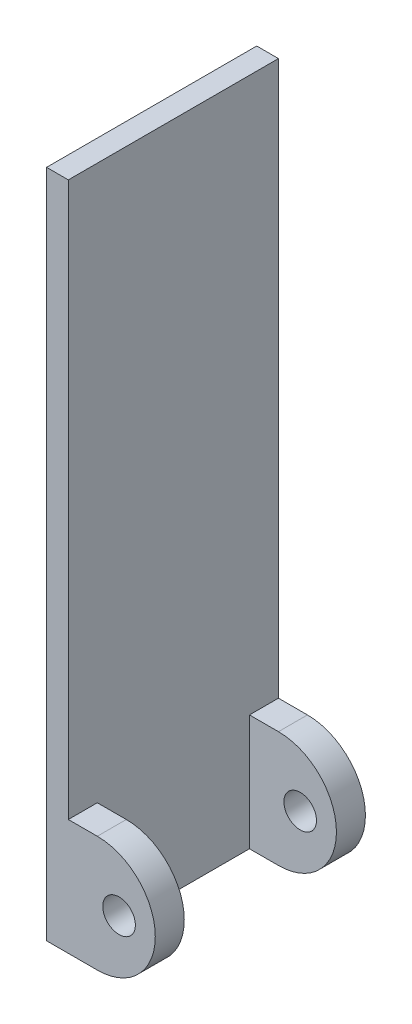
ISO-10303-21;
HEADER;
FILE_DESCRIPTION(('STEP AP214'),'2;1');
FILE_NAME('part.step','',(''),(''),'','','');
FILE_SCHEMA(('AUTOMOTIVE_DESIGN { 1 0 10303 214 1 1 1 1 }'));
ENDSEC;
DATA;
#1=APPLICATION_CONTEXT('core data for automotive mechanical design processes');
#2=APPLICATION_PROTOCOL_DEFINITION('international standard','automotive_design',2000,#1);
#3=PRODUCT_CONTEXT('',#1,'mechanical');
#4=PRODUCT('Part','Part','',(#3));
#5=PRODUCT_RELATED_PRODUCT_CATEGORY('part','',(#4));
#6=PRODUCT_DEFINITION_FORMATION('','',#4);
#7=PRODUCT_DEFINITION_CONTEXT('part definition',#1,'design');
#8=PRODUCT_DEFINITION('design','',#6,#7);
#9=PRODUCT_DEFINITION_SHAPE('','',#8);
#10=(LENGTH_UNIT() NAMED_UNIT(*) SI_UNIT(.MILLI.,.METRE.));
#11=(NAMED_UNIT(*) PLANE_ANGLE_UNIT() SI_UNIT($,.RADIAN.));
#12=(NAMED_UNIT(*) SI_UNIT($,.STERADIAN.) SOLID_ANGLE_UNIT());
#13=UNCERTAINTY_MEASURE_WITH_UNIT(LENGTH_MEASURE(1.E-05),#10,'distance_accuracy_value','');
#14=(GEOMETRIC_REPRESENTATION_CONTEXT(3) GLOBAL_UNCERTAINTY_ASSIGNED_CONTEXT((#13)) GLOBAL_UNIT_ASSIGNED_CONTEXT((#10,
#11,#12)) REPRESENTATION_CONTEXT('',''));
#15=CARTESIAN_POINT('',(0.,0.,0.));
#16=DIRECTION('',(0.,0.,1.));
#17=DIRECTION('',(1.,0.,0.));
#18=AXIS2_PLACEMENT_3D('',#15,#16,#17);
#19=CARTESIAN_POINT('',(5.5,-38.223,4.));
#20=DIRECTION('',(0.,0.,-1.));
#21=DIRECTION('',(-1.,0.,0.));
#22=AXIS2_PLACEMENT_3D('',#19,#20,#21);
#23=CYLINDRICAL_SURFACE('',#22,8.);
#24=DIRECTION('',(0.,0.,1.));
#25=VECTOR('',#24,1.);
#26=CARTESIAN_POINT('',(5.5,-30.223,4.));
#27=LINE('',#26,#25);
#28=CARTESIAN_POINT('',(5.5,-30.223,4.));
#29=VERTEX_POINT('',#28);
#30=CARTESIAN_POINT('',(5.5,-30.223,0.));
#31=VERTEX_POINT('',#30);
#32=EDGE_CURVE('E135',#29,#31,#27,.F.);
#33=ORIENTED_EDGE('',*,*,#32,.F.);
#34=CARTESIAN_POINT('',(5.5,-38.223,4.));
#35=DIRECTION('',(0.,0.,-1.));
#36=DIRECTION('',(-1.,0.,0.));
#37=AXIS2_PLACEMENT_3D('',#34,#35,#36);
#38=CIRCLE('',#37,8.);
#39=CARTESIAN_POINT('',(5.50000000000001,-46.223,4.));
#40=VERTEX_POINT('',#39);
#41=EDGE_CURVE('E45',#40,#29,#38,.F.);
#42=ORIENTED_EDGE('',*,*,#41,.F.);
#43=DIRECTION('',(0.,0.,-1.));
#44=VECTOR('',#43,1.);
#45=CARTESIAN_POINT('',(5.5,-46.223,29.));
#46=LINE('',#45,#44);
#47=CARTESIAN_POINT('',(5.5,-46.223,0.));
#48=VERTEX_POINT('',#47);
#49=EDGE_CURVE('E203',#48,#40,#46,.F.);
#50=ORIENTED_EDGE('',*,*,#49,.F.);
#51=CARTESIAN_POINT('',(5.5,-38.223,0.));
#52=DIRECTION('',(0.,0.,-1.));
#53=DIRECTION('',(-1.,0.,0.));
#54=AXIS2_PLACEMENT_3D('',#51,#52,#53);
#55=CIRCLE('',#54,8.);
#56=EDGE_CURVE('E11',#31,#48,#55,.T.);
#57=ORIENTED_EDGE('',*,*,#56,.F.);
#58=EDGE_LOOP('',(#33,#42,#50,#57));
#59=FACE_BOUND('',#58,.T.);
#60=ADVANCED_FACE('F37',(#59),#23,.T.);
#61=CARTESIAN_POINT('',(5.5,-38.223,29.));
#62=DIRECTION('',(0.,0.,1.));
#63=DIRECTION('',(1.,0.,0.));
#64=AXIS2_PLACEMENT_3D('',#61,#62,#63);
#65=CYLINDRICAL_SURFACE('',#64,8.);
#66=DIRECTION('',(0.,0.,-1.));
#67=VECTOR('',#66,1.);
#68=CARTESIAN_POINT('',(5.5,-30.223,29.));
#69=LINE('',#68,#67);
#70=CARTESIAN_POINT('',(5.5,-30.223,29.));
#71=VERTEX_POINT('',#70);
#72=CARTESIAN_POINT('',(5.5,-30.223,25.));
#73=VERTEX_POINT('',#72);
#74=EDGE_CURVE('E192',#71,#73,#69,.T.);
#75=ORIENTED_EDGE('',*,*,#74,.F.);
#76=CARTESIAN_POINT('',(5.5,-38.223,29.));
#77=DIRECTION('',(0.,0.,-1.));
#78=DIRECTION('',(-1.,0.,0.));
#79=AXIS2_PLACEMENT_3D('',#76,#77,#78);
#80=CIRCLE('',#79,8.);
#81=CARTESIAN_POINT('',(5.5,-46.223,29.));
#82=VERTEX_POINT('',#81);
#83=EDGE_CURVE('E198',#82,#71,#80,.F.);
#84=ORIENTED_EDGE('',*,*,#83,.F.);
#85=DIRECTION('',(0.,0.,-1.));
#86=VECTOR('',#85,1.);
#87=CARTESIAN_POINT('',(5.5,-46.223,29.));
#88=LINE('',#87,#86);
#89=CARTESIAN_POINT('',(5.50000000000001,-46.223,25.));
#90=VERTEX_POINT('',#89);
#91=EDGE_CURVE('E195',#90,#82,#88,.F.);
#92=ORIENTED_EDGE('',*,*,#91,.F.);
#93=CARTESIAN_POINT('',(5.5,-38.223,25.));
#94=DIRECTION('',(0.,0.,1.));
#95=DIRECTION('',(1.,0.,0.));
#96=AXIS2_PLACEMENT_3D('',#93,#94,#95);
#97=CIRCLE('',#96,8.);
#98=EDGE_CURVE('E200',#73,#90,#97,.F.);
#99=ORIENTED_EDGE('',*,*,#98,.F.);
#100=EDGE_LOOP('',(#75,#84,#92,#99));
#101=FACE_BOUND('',#100,.T.);
#102=ADVANCED_FACE('F234',(#101),#65,.T.);
#103=CARTESIAN_POINT('',(1.49999999999999,46.223,29.));
#104=DIRECTION('',(-1.,0.,0.));
#105=DIRECTION('',(0.,-1.,0.));
#106=AXIS2_PLACEMENT_3D('',#103,#104,#105);
#107=PLANE('',#106);
#108=DIRECTION('',(0.,1.,0.));
#109=VECTOR('',#108,1.);
#110=CARTESIAN_POINT('',(1.5,0.,4.));
#111=LINE('',#110,#109);
#112=CARTESIAN_POINT('',(1.50000000000001,-46.223,4.00000000000001));
#113=VERTEX_POINT('',#112);
#114=CARTESIAN_POINT('',(1.5,-30.223,4.));
#115=VERTEX_POINT('',#114);
#116=EDGE_CURVE('E126',#113,#115,#111,.T.);
#117=ORIENTED_EDGE('',*,*,#116,.T.);
#118=DIRECTION('',(0.,0.,-1.));
#119=VECTOR('',#118,1.);
#120=CARTESIAN_POINT('',(1.5,-30.223,4.));
#121=LINE('',#120,#119);
#122=CARTESIAN_POINT('',(1.5,-30.223,0.));
#123=VERTEX_POINT('',#122);
#124=EDGE_CURVE('E123',#115,#123,#121,.T.);
#125=ORIENTED_EDGE('',*,*,#124,.T.);
#126=DIRECTION('',(0.,1.,0.));
#127=VECTOR('',#126,1.);
#128=CARTESIAN_POINT('',(1.49999999999999,46.223,0.));
#129=LINE('',#128,#127);
#130=CARTESIAN_POINT('',(1.49999999999999,46.223,0.));
#131=VERTEX_POINT('',#130);
#132=EDGE_CURVE('E109',#123,#131,#129,.T.);
#133=ORIENTED_EDGE('',*,*,#132,.T.);
#134=DIRECTION('',(0.,0.,-1.));
#135=VECTOR('',#134,1.);
#136=CARTESIAN_POINT('',(1.49999999999999,46.223,29.));
#137=LINE('',#136,#135);
#138=CARTESIAN_POINT('',(1.49999999999999,46.223,29.));
#139=VERTEX_POINT('',#138);
#140=EDGE_CURVE('E185',#139,#131,#137,.T.);
#141=ORIENTED_EDGE('',*,*,#140,.F.);
#142=DIRECTION('',(0.,1.,0.));
#143=VECTOR('',#142,1.);
#144=CARTESIAN_POINT('',(1.49999999999999,46.223,29.));
#145=LINE('',#144,#143);
#146=CARTESIAN_POINT('',(1.5,-30.223,29.));
#147=VERTEX_POINT('',#146);
#148=EDGE_CURVE('E173',#147,#139,#145,.T.);
#149=ORIENTED_EDGE('',*,*,#148,.F.);
#150=DIRECTION('',(0.,0.,1.));
#151=VECTOR('',#150,1.);
#152=CARTESIAN_POINT('',(1.5,-30.223,25.));
#153=LINE('',#152,#151);
#154=CARTESIAN_POINT('',(1.5,-30.223,25.));
#155=VERTEX_POINT('',#154);
#156=EDGE_CURVE('E159',#155,#147,#153,.T.);
#157=ORIENTED_EDGE('',*,*,#156,.F.);
#158=DIRECTION('',(0.,1.,0.));
#159=VECTOR('',#158,1.);
#160=CARTESIAN_POINT('',(1.5,0.,25.));
#161=LINE('',#160,#159);
#162=CARTESIAN_POINT('',(1.50000000000001,-46.223,25.));
#163=VERTEX_POINT('',#162);
#164=EDGE_CURVE('E156',#163,#155,#161,.T.);
#165=ORIENTED_EDGE('',*,*,#164,.F.);
#166=DIRECTION('',(0.,0.,-1.));
#167=VECTOR('',#166,1.);
#168=CARTESIAN_POINT('',(1.50000000000001,-46.223,29.));
#169=LINE('',#168,#167);
#170=EDGE_CURVE('E187',#163,#113,#169,.T.);
#171=ORIENTED_EDGE('',*,*,#170,.T.);
#172=EDGE_LOOP('',(#117,#125,#133,#141,#149,#157,#165,#171));
#173=FACE_BOUND('',#172,.T.);
#174=ADVANCED_FACE('F124',(#173),#107,.F.);
#175=CARTESIAN_POINT('',(-1.50000000000001,46.223,29.));
#176=DIRECTION('',(1.,0.,0.));
#177=DIRECTION('',(0.,1.,0.));
#178=AXIS2_PLACEMENT_3D('',#175,#176,#177);
#179=PLANE('',#178);
#180=DIRECTION('',(0.,-1.,0.));
#181=VECTOR('',#180,1.);
#182=CARTESIAN_POINT('',(-1.50000000000001,46.223,0.));
#183=LINE('',#182,#181);
#184=CARTESIAN_POINT('',(-1.50000000000001,46.223,0.));
#185=VERTEX_POINT('',#184);
#186=CARTESIAN_POINT('',(-1.49999999999999,-46.223,0.));
#187=VERTEX_POINT('',#186);
#188=EDGE_CURVE('E166',#185,#187,#183,.T.);
#189=ORIENTED_EDGE('',*,*,#188,.T.);
#190=DIRECTION('',(0.,0.,-1.));
#191=VECTOR('',#190,1.);
#192=CARTESIAN_POINT('',(-1.49999999999999,-46.223,29.));
#193=LINE('',#192,#191);
#194=CARTESIAN_POINT('',(-1.49999999999999,-46.223,29.));
#195=VERTEX_POINT('',#194);
#196=EDGE_CURVE('E189',#195,#187,#193,.T.);
#197=ORIENTED_EDGE('',*,*,#196,.F.);
#198=DIRECTION('',(0.,-1.,0.));
#199=VECTOR('',#198,1.);
#200=CARTESIAN_POINT('',(-1.50000000000001,46.223,29.));
#201=LINE('',#200,#199);
#202=CARTESIAN_POINT('',(-1.50000000000001,46.223,29.));
#203=VERTEX_POINT('',#202);
#204=EDGE_CURVE('E167',#203,#195,#201,.T.);
#205=ORIENTED_EDGE('',*,*,#204,.F.);
#206=DIRECTION('',(0.,0.,-1.));
#207=VECTOR('',#206,1.);
#208=CARTESIAN_POINT('',(-1.50000000000001,46.223,29.));
#209=LINE('',#208,#207);
#210=EDGE_CURVE('E177',#203,#185,#209,.T.);
#211=ORIENTED_EDGE('',*,*,#210,.T.);
#212=EDGE_LOOP('',(#189,#197,#205,#211));
#213=FACE_BOUND('',#212,.T.);
#214=ADVANCED_FACE('F214',(#213),#179,.F.);
#215=CARTESIAN_POINT('',(1.50000000000001,-46.223,29.));
#216=DIRECTION('',(0.,1.,0.));
#217=DIRECTION('',(0.,0.,1.));
#218=AXIS2_PLACEMENT_3D('',#215,#216,#217);
#219=PLANE('',#218);
#220=DIRECTION('',(1.,0.,0.));
#221=VECTOR('',#220,1.);
#222=CARTESIAN_POINT('',(1.50000000000001,-46.223,0.));
#223=LINE('',#222,#221);
#224=EDGE_CURVE('E120',#187,#48,#223,.T.);
#225=ORIENTED_EDGE('',*,*,#224,.T.);
#226=ORIENTED_EDGE('',*,*,#49,.T.);
#227=DIRECTION('',(1.,0.,0.));
#228=VECTOR('',#227,1.);
#229=CARTESIAN_POINT('',(0.,-46.223,4.));
#230=LINE('',#229,#228);
#231=EDGE_CURVE('E140',#113,#40,#230,.T.);
#232=ORIENTED_EDGE('',*,*,#231,.F.);
#233=ORIENTED_EDGE('',*,*,#170,.F.);
#234=DIRECTION('',(1.,0.,0.));
#235=VECTOR('',#234,1.);
#236=CARTESIAN_POINT('',(0.,-46.223,25.));
#237=LINE('',#236,#235);
#238=EDGE_CURVE('E149',#163,#90,#237,.T.);
#239=ORIENTED_EDGE('',*,*,#238,.T.);
#240=ORIENTED_EDGE('',*,*,#91,.T.);
#241=DIRECTION('',(1.,0.,0.));
#242=VECTOR('',#241,1.);
#243=CARTESIAN_POINT('',(1.50000000000001,-46.223,29.));
#244=LINE('',#243,#242);
#245=EDGE_CURVE('E170',#195,#82,#244,.T.);
#246=ORIENTED_EDGE('',*,*,#245,.F.);
#247=ORIENTED_EDGE('',*,*,#196,.T.);
#248=EDGE_LOOP('',(#225,#226,#232,#233,#239,#240,#246,#247));
#249=FACE_BOUND('',#248,.T.);
#250=ADVANCED_FACE('F211',(#249),#219,.F.);
#251=CARTESIAN_POINT('',(1.49999999999999,46.223,29.));
#252=DIRECTION('',(0.,-1.,0.));
#253=DIRECTION('',(0.,0.,-1.));
#254=AXIS2_PLACEMENT_3D('',#251,#252,#253);
#255=PLANE('',#254);
#256=DIRECTION('',(-1.,0.,0.));
#257=VECTOR('',#256,1.);
#258=CARTESIAN_POINT('',(1.49999999999999,46.223,0.));
#259=LINE('',#258,#257);
#260=EDGE_CURVE('E116',#131,#185,#259,.T.);
#261=ORIENTED_EDGE('',*,*,#260,.T.);
#262=ORIENTED_EDGE('',*,*,#210,.F.);
#263=DIRECTION('',(-1.,0.,0.));
#264=VECTOR('',#263,1.);
#265=CARTESIAN_POINT('',(1.49999999999999,46.223,29.));
#266=LINE('',#265,#264);
#267=EDGE_CURVE('E175',#139,#203,#266,.T.);
#268=ORIENTED_EDGE('',*,*,#267,.F.);
#269=ORIENTED_EDGE('',*,*,#140,.T.);
#270=EDGE_LOOP('',(#261,#262,#268,#269));
#271=FACE_BOUND('',#270,.T.);
#272=ADVANCED_FACE('F219',(#271),#255,.F.);
#273=CARTESIAN_POINT('',(0.,0.,29.));
#274=DIRECTION('',(0.,0.,-1.));
#275=DIRECTION('',(-1.,0.,0.));
#276=AXIS2_PLACEMENT_3D('',#273,#274,#275);
#277=PLANE('',#276);
#278=ORIENTED_EDGE('',*,*,#245,.T.);
#279=ORIENTED_EDGE('',*,*,#83,.T.);
#280=DIRECTION('',(1.,0.,0.));
#281=VECTOR('',#280,1.);
#282=CARTESIAN_POINT('',(0.,-30.223,29.));
#283=LINE('',#282,#281);
#284=EDGE_CURVE('E150',#147,#71,#283,.T.);
#285=ORIENTED_EDGE('',*,*,#284,.F.);
#286=ORIENTED_EDGE('',*,*,#148,.T.);
#287=ORIENTED_EDGE('',*,*,#267,.T.);
#288=ORIENTED_EDGE('',*,*,#204,.T.);
#289=EDGE_LOOP('',(#278,#279,#285,#286,#287,#288));
#290=FACE_BOUND('',#289,.T.);
#291=CARTESIAN_POINT('',(8.49999999999999,-38.223,29.));
#292=DIRECTION('',(0.,0.,1.));
#293=DIRECTION('',(1.,0.,0.));
#294=AXIS2_PLACEMENT_3D('',#291,#292,#293);
#295=CIRCLE('',#294,2.25000000000001);
#296=CARTESIAN_POINT('',(10.75,-38.223,29.));
#297=VERTEX_POINT('',#296);
#298=EDGE_CURVE('E130',#297,#297,#295,.T.);
#299=ORIENTED_EDGE('',*,*,#298,.F.);
#300=EDGE_LOOP('',(#299));
#301=FACE_BOUND('',#300,.T.);
#302=ADVANCED_FACE('F223',(#290,#301),#277,.F.);
#303=CARTESIAN_POINT('',(0.,0.,0.));
#304=DIRECTION('',(0.,0.,-1.));
#305=DIRECTION('',(-1.,0.,0.));
#306=AXIS2_PLACEMENT_3D('',#303,#304,#305);
#307=PLANE('',#306);
#308=DIRECTION('',(1.,0.,0.));
#309=VECTOR('',#308,1.);
#310=CARTESIAN_POINT('',(0.,-30.223,0.));
#311=LINE('',#310,#309);
#312=EDGE_CURVE('E114',#123,#31,#311,.T.);
#313=ORIENTED_EDGE('',*,*,#312,.T.);
#314=ORIENTED_EDGE('',*,*,#56,.T.);
#315=ORIENTED_EDGE('',*,*,#224,.F.);
#316=ORIENTED_EDGE('',*,*,#188,.F.);
#317=ORIENTED_EDGE('',*,*,#260,.F.);
#318=ORIENTED_EDGE('',*,*,#132,.F.);
#319=EDGE_LOOP('',(#313,#314,#315,#316,#317,#318));
#320=FACE_BOUND('',#319,.T.);
#321=CARTESIAN_POINT('',(8.49999999999999,-38.223,0.));
#322=DIRECTION('',(0.,0.,1.));
#323=DIRECTION('',(1.,0.,0.));
#324=AXIS2_PLACEMENT_3D('',#321,#322,#323);
#325=CIRCLE('',#324,2.25000000000001);
#326=CARTESIAN_POINT('',(10.75,-38.223,0.));
#327=VERTEX_POINT('',#326);
#328=EDGE_CURVE('E137',#327,#327,#325,.T.);
#329=ORIENTED_EDGE('',*,*,#328,.T.);
#330=EDGE_LOOP('',(#329));
#331=FACE_BOUND('',#330,.T.);
#332=ADVANCED_FACE('F111',(#320,#331),#307,.T.);
#333=CARTESIAN_POINT('',(0.,-30.223,25.));
#334=DIRECTION('',(0.,-1.,0.));
#335=DIRECTION('',(0.,0.,-1.));
#336=AXIS2_PLACEMENT_3D('',#333,#334,#335);
#337=PLANE('',#336);
#338=ORIENTED_EDGE('',*,*,#284,.T.);
#339=ORIENTED_EDGE('',*,*,#74,.T.);
#340=DIRECTION('',(1.,0.,0.));
#341=VECTOR('',#340,1.);
#342=CARTESIAN_POINT('',(0.,-30.223,25.));
#343=LINE('',#342,#341);
#344=EDGE_CURVE('E153',#155,#73,#343,.T.);
#345=ORIENTED_EDGE('',*,*,#344,.F.);
#346=ORIENTED_EDGE('',*,*,#156,.T.);
#347=EDGE_LOOP('',(#338,#339,#345,#346));
#348=FACE_BOUND('',#347,.T.);
#349=ADVANCED_FACE('F227',(#348),#337,.F.);
#350=CARTESIAN_POINT('',(8.49999999999999,-38.223,25.));
#351=DIRECTION('',(0.,0.,1.));
#352=DIRECTION('',(1.,0.,0.));
#353=AXIS2_PLACEMENT_3D('',#350,#351,#352);
#354=CYLINDRICAL_SURFACE('',#353,2.25000000000001);
#355=CARTESIAN_POINT('',(8.49999999999999,-38.223,25.));
#356=DIRECTION('',(0.,0.,1.));
#357=DIRECTION('',(1.,0.,0.));
#358=AXIS2_PLACEMENT_3D('',#355,#356,#357);
#359=CIRCLE('',#358,2.25000000000001);
#360=CARTESIAN_POINT('',(10.75,-38.223,25.));
#361=VERTEX_POINT('',#360);
#362=EDGE_CURVE('E146',#361,#361,#359,.T.);
#363=ORIENTED_EDGE('',*,*,#362,.F.);
#364=EDGE_LOOP('',(#363));
#365=FACE_BOUND('',#364,.T.);
#366=ORIENTED_EDGE('',*,*,#298,.T.);
#367=EDGE_LOOP('',(#366));
#368=FACE_BOUND('',#367,.T.);
#369=ADVANCED_FACE('F255',(#365,#368),#354,.F.);
#370=CARTESIAN_POINT('',(0.,0.,25.));
#371=DIRECTION('',(0.,0.,1.));
#372=DIRECTION('',(1.,0.,0.));
#373=AXIS2_PLACEMENT_3D('',#370,#371,#372);
#374=PLANE('',#373);
#375=ORIENTED_EDGE('',*,*,#362,.T.);
#376=EDGE_LOOP('',(#375));
#377=FACE_BOUND('',#376,.T.);
#378=ORIENTED_EDGE('',*,*,#344,.T.);
#379=ORIENTED_EDGE('',*,*,#98,.T.);
#380=ORIENTED_EDGE('',*,*,#238,.F.);
#381=ORIENTED_EDGE('',*,*,#164,.T.);
#382=EDGE_LOOP('',(#378,#379,#380,#381));
#383=FACE_BOUND('',#382,.T.);
#384=ADVANCED_FACE('F230',(#377,#383),#374,.F.);
#385=CARTESIAN_POINT('',(0.,-30.223,4.));
#386=DIRECTION('',(0.,1.,0.));
#387=DIRECTION('',(0.,0.,1.));
#388=AXIS2_PLACEMENT_3D('',#385,#386,#387);
#389=PLANE('',#388);
#390=DIRECTION('',(1.,0.,0.));
#391=VECTOR('',#390,1.);
#392=CARTESIAN_POINT('',(0.,-30.223,4.));
#393=LINE('',#392,#391);
#394=EDGE_CURVE('E131',#115,#29,#393,.T.);
#395=ORIENTED_EDGE('',*,*,#394,.T.);
#396=ORIENTED_EDGE('',*,*,#32,.T.);
#397=ORIENTED_EDGE('',*,*,#312,.F.);
#398=ORIENTED_EDGE('',*,*,#124,.F.);
#399=EDGE_LOOP('',(#395,#396,#397,#398));
#400=FACE_BOUND('',#399,.T.);
#401=ADVANCED_FACE('F134',(#400),#389,.T.);
#402=CARTESIAN_POINT('',(8.49999999999999,-38.223,4.));
#403=DIRECTION('',(0.,0.,-1.));
#404=DIRECTION('',(-1.,0.,0.));
#405=AXIS2_PLACEMENT_3D('',#402,#403,#404);
#406=CYLINDRICAL_SURFACE('',#405,2.25000000000001);
#407=CARTESIAN_POINT('',(8.49999999999999,-38.223,4.));
#408=DIRECTION('',(0.,0.,1.));
#409=DIRECTION('',(1.,0.,0.));
#410=AXIS2_PLACEMENT_3D('',#407,#408,#409);
#411=CIRCLE('',#410,2.25000000000001);
#412=CARTESIAN_POINT('',(10.75,-38.223,4.));
#413=VERTEX_POINT('',#412);
#414=EDGE_CURVE('E136',#413,#413,#411,.T.);
#415=ORIENTED_EDGE('',*,*,#414,.T.);
#416=EDGE_LOOP('',(#415));
#417=FACE_BOUND('',#416,.T.);
#418=ORIENTED_EDGE('',*,*,#328,.F.);
#419=EDGE_LOOP('',(#418));
#420=FACE_BOUND('',#419,.T.);
#421=ADVANCED_FACE('F264',(#417,#420),#406,.F.);
#422=CARTESIAN_POINT('',(0.,0.,4.));
#423=DIRECTION('',(0.,0.,-1.));
#424=DIRECTION('',(1.,0.,0.));
#425=AXIS2_PLACEMENT_3D('',#422,#423,#424);
#426=PLANE('',#425);
#427=ORIENTED_EDGE('',*,*,#414,.F.);
#428=EDGE_LOOP('',(#427));
#429=FACE_BOUND('',#428,.T.);
#430=ORIENTED_EDGE('',*,*,#231,.T.);
#431=ORIENTED_EDGE('',*,*,#41,.T.);
#432=ORIENTED_EDGE('',*,*,#394,.F.);
#433=ORIENTED_EDGE('',*,*,#116,.F.);
#434=EDGE_LOOP('',(#430,#431,#432,#433));
#435=FACE_BOUND('',#434,.T.);
#436=ADVANCED_FACE('F206',(#429,#435),#426,.F.);
#437=CLOSED_SHELL('',(#60,#102,#174,#214,#250,#272,#302,#332,#349,#369,#384,#401,#421,#436));
#438=MANIFOLD_SOLID_BREP('B2',#437);
#439=ADVANCED_BREP_SHAPE_REPRESENTATION('',(#18,#438),#14);
#440=SHAPE_DEFINITION_REPRESENTATION(#9,#439);
ENDSEC;
END-ISO-10303-21;
